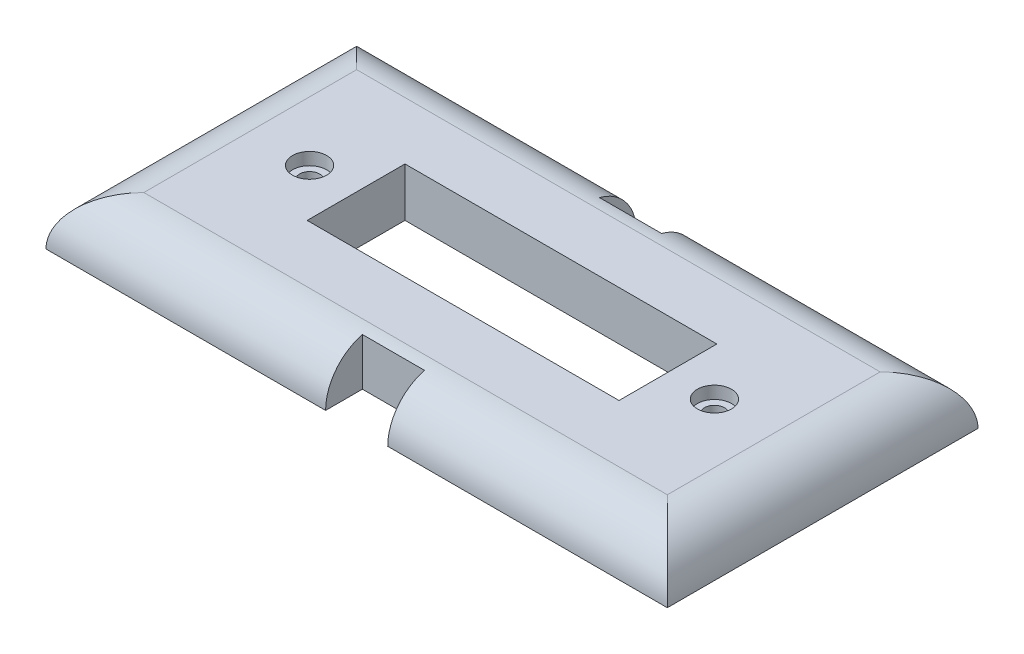
ISO-10303-21;
HEADER;
FILE_DESCRIPTION(('STEP AP214'),'2;1');
FILE_NAME('part.step','',(''),(''),'','','');
FILE_SCHEMA(('AUTOMOTIVE_DESIGN { 1 0 10303 214 1 1 1 1 }'));
ENDSEC;
DATA;
#1=APPLICATION_CONTEXT('core data for automotive mechanical design processes');
#2=APPLICATION_PROTOCOL_DEFINITION('international standard','automotive_design',2000,#1);
#3=PRODUCT_CONTEXT('',#1,'mechanical');
#4=PRODUCT('Part','Part','',(#3));
#5=PRODUCT_RELATED_PRODUCT_CATEGORY('part','',(#4));
#6=PRODUCT_DEFINITION_FORMATION('','',#4);
#7=PRODUCT_DEFINITION_CONTEXT('part definition',#1,'design');
#8=PRODUCT_DEFINITION('design','',#6,#7);
#9=PRODUCT_DEFINITION_SHAPE('','',#8);
#10=(LENGTH_UNIT() NAMED_UNIT(*) SI_UNIT(.MILLI.,.METRE.));
#11=(NAMED_UNIT(*) PLANE_ANGLE_UNIT() SI_UNIT($,.RADIAN.));
#12=(NAMED_UNIT(*) SI_UNIT($,.STERADIAN.) SOLID_ANGLE_UNIT());
#13=UNCERTAINTY_MEASURE_WITH_UNIT(LENGTH_MEASURE(1.E-05),#10,'distance_accuracy_value','');
#14=(GEOMETRIC_REPRESENTATION_CONTEXT(3) GLOBAL_UNCERTAINTY_ASSIGNED_CONTEXT((#13)) GLOBAL_UNIT_ASSIGNED_CONTEXT((#10,
#11,#12)) REPRESENTATION_CONTEXT('',''));
#15=CARTESIAN_POINT('',(0.,0.,0.));
#16=DIRECTION('',(0.,0.,1.));
#17=DIRECTION('',(1.,0.,0.));
#18=AXIS2_PLACEMENT_3D('',#15,#16,#17);
#19=CARTESIAN_POINT('',(33.1,8.,0.));
#20=DIRECTION('',(0.,-1.,0.));
#21=DIRECTION('',(0.,0.,-1.));
#22=AXIS2_PLACEMENT_3D('',#19,#20,#21);
#23=CYLINDRICAL_SURFACE('',#22,1.63195);
#24=CARTESIAN_POINT('',(33.1,0.,0.));
#25=DIRECTION('',(0.,-1.,0.));
#26=DIRECTION('',(0.,0.,-1.));
#27=AXIS2_PLACEMENT_3D('',#24,#25,#26);
#28=CIRCLE('',#27,1.63195);
#29=CARTESIAN_POINT('',(33.1,0.,-1.63195));
#30=VERTEX_POINT('',#29);
#31=EDGE_CURVE('E228',#30,#30,#28,.T.);
#32=ORIENTED_EDGE('',*,*,#31,.T.);
#33=EDGE_LOOP('',(#32));
#34=FACE_BOUND('',#33,.T.);
#35=CARTESIAN_POINT('',(33.1,5.968,0.));
#36=DIRECTION('',(0.,1.,0.));
#37=DIRECTION('',(0.,0.,1.));
#38=AXIS2_PLACEMENT_3D('',#35,#36,#37);
#39=CIRCLE('',#38,1.63195);
#40=CARTESIAN_POINT('',(33.1,5.968,1.63195));
#41=VERTEX_POINT('',#40);
#42=EDGE_CURVE('E36',#41,#41,#39,.F.);
#43=ORIENTED_EDGE('',*,*,#42,.F.);
#44=EDGE_LOOP('',(#43));
#45=FACE_BOUND('',#44,.T.);
#46=ADVANCED_FACE('F32',(#34,#45),#23,.F.);
#47=CARTESIAN_POINT('',(-33.1,8.,0.));
#48=DIRECTION('',(0.,-1.,0.));
#49=DIRECTION('',(0.,0.,-1.));
#50=AXIS2_PLACEMENT_3D('',#47,#48,#49);
#51=CYLINDRICAL_SURFACE('',#50,1.63195);
#52=CARTESIAN_POINT('',(-33.1,0.,0.));
#53=DIRECTION('',(0.,-1.,0.));
#54=DIRECTION('',(0.,0.,-1.));
#55=AXIS2_PLACEMENT_3D('',#52,#53,#54);
#56=CIRCLE('',#55,1.63195);
#57=CARTESIAN_POINT('',(-33.1,0.,-1.63195));
#58=VERTEX_POINT('',#57);
#59=EDGE_CURVE('E183',#58,#58,#56,.T.);
#60=ORIENTED_EDGE('',*,*,#59,.T.);
#61=EDGE_LOOP('',(#60));
#62=FACE_BOUND('',#61,.T.);
#63=CARTESIAN_POINT('',(-33.1,5.968,0.));
#64=DIRECTION('',(0.,1.,0.));
#65=DIRECTION('',(0.,0.,1.));
#66=AXIS2_PLACEMENT_3D('',#63,#64,#65);
#67=CIRCLE('',#66,1.63195);
#68=CARTESIAN_POINT('',(-33.1,5.968,1.63195));
#69=VERTEX_POINT('',#68);
#70=EDGE_CURVE('E143',#69,#69,#67,.F.);
#71=ORIENTED_EDGE('',*,*,#70,.F.);
#72=EDGE_LOOP('',(#71));
#73=FACE_BOUND('',#72,.T.);
#74=ADVANCED_FACE('F291',(#62,#73),#51,.F.);
#75=CARTESIAN_POINT('',(0.,8.,0.));
#76=DIRECTION('',(0.,-1.,0.));
#77=DIRECTION('',(0.,0.,-1.));
#78=AXIS2_PLACEMENT_3D('',#75,#76,#77);
#79=PLANE('',#78);
#80=CARTESIAN_POINT('',(33.1,8.,0.));
#81=DIRECTION('',(0.,1.,0.));
#82=DIRECTION('',(0.,0.,1.));
#83=AXIS2_PLACEMENT_3D('',#80,#81,#82);
#84=CIRCLE('',#83,2.794);
#85=CARTESIAN_POINT('',(33.1,8.,2.794));
#86=VERTEX_POINT('',#85);
#87=EDGE_CURVE('E211',#86,#86,#84,.T.);
#88=ORIENTED_EDGE('',*,*,#87,.F.);
#89=EDGE_LOOP('',(#88));
#90=FACE_BOUND('',#89,.T.);
#91=CARTESIAN_POINT('',(-33.1,8.,0.));
#92=DIRECTION('',(0.,1.,0.));
#93=DIRECTION('',(0.,0.,1.));
#94=AXIS2_PLACEMENT_3D('',#91,#92,#93);
#95=CIRCLE('',#94,2.794);
#96=CARTESIAN_POINT('',(-33.1,8.,2.794));
#97=VERTEX_POINT('',#96);
#98=EDGE_CURVE('E204',#97,#97,#95,.T.);
#99=ORIENTED_EDGE('',*,*,#98,.F.);
#100=EDGE_LOOP('',(#99));
#101=FACE_BOUND('',#100,.T.);
#102=DIRECTION('',(0.,0.,-1.));
#103=VECTOR('',#102,1.);
#104=CARTESIAN_POINT('',(42.8,8.,0.));
#105=LINE('',#104,#103);
#106=CARTESIAN_POINT('',(42.8,8.,17.4));
#107=VERTEX_POINT('',#106);
#108=CARTESIAN_POINT('',(42.8,8.,-17.4));
#109=VERTEX_POINT('',#108);
#110=EDGE_CURVE('E174',#107,#109,#105,.T.);
#111=ORIENTED_EDGE('',*,*,#110,.T.);
#112=DIRECTION('',(-1.,0.,0.));
#113=VECTOR('',#112,1.);
#114=CARTESIAN_POINT('',(0.,8.,-17.4));
#115=LINE('',#114,#113);
#116=CARTESIAN_POINT('',(-42.8,8.,-17.4));
#117=VERTEX_POINT('',#116);
#118=EDGE_CURVE('E176',#109,#117,#115,.T.);
#119=ORIENTED_EDGE('',*,*,#118,.T.);
#120=DIRECTION('',(0.,0.,1.));
#121=VECTOR('',#120,1.);
#122=CARTESIAN_POINT('',(-42.8,8.,0.));
#123=LINE('',#122,#121);
#124=CARTESIAN_POINT('',(-42.8,8.,17.4));
#125=VERTEX_POINT('',#124);
#126=EDGE_CURVE('E170',#117,#125,#123,.T.);
#127=ORIENTED_EDGE('',*,*,#126,.T.);
#128=DIRECTION('',(1.,0.,0.));
#129=VECTOR('',#128,1.);
#130=CARTESIAN_POINT('',(0.,8.,17.4));
#131=LINE('',#130,#129);
#132=EDGE_CURVE('E172',#125,#107,#131,.T.);
#133=ORIENTED_EDGE('',*,*,#132,.T.);
#134=EDGE_LOOP('',(#111,#119,#127,#133));
#135=FACE_BOUND('',#134,.T.);
#136=DIRECTION('',(-1.,0.,0.));
#137=VECTOR('',#136,1.);
#138=CARTESIAN_POINT('',(-25.5,8.,-8.));
#139=LINE('',#138,#137);
#140=CARTESIAN_POINT('',(25.5,8.,-8.));
#141=VERTEX_POINT('',#140);
#142=CARTESIAN_POINT('',(-25.5,8.,-8.));
#143=VERTEX_POINT('',#142);
#144=EDGE_CURVE('E249',#141,#143,#139,.T.);
#145=ORIENTED_EDGE('',*,*,#144,.F.);
#146=DIRECTION('',(0.,0.,-1.));
#147=VECTOR('',#146,1.);
#148=CARTESIAN_POINT('',(25.5,8.,8.));
#149=LINE('',#148,#147);
#150=CARTESIAN_POINT('',(25.5,8.,8.));
#151=VERTEX_POINT('',#150);
#152=EDGE_CURVE('E191',#151,#141,#149,.T.);
#153=ORIENTED_EDGE('',*,*,#152,.F.);
#154=DIRECTION('',(1.,0.,0.));
#155=VECTOR('',#154,1.);
#156=CARTESIAN_POINT('',(-25.5,8.,8.));
#157=LINE('',#156,#155);
#158=CARTESIAN_POINT('',(-25.5,8.,8.));
#159=VERTEX_POINT('',#158);
#160=EDGE_CURVE('E238',#159,#151,#157,.T.);
#161=ORIENTED_EDGE('',*,*,#160,.F.);
#162=DIRECTION('',(0.,0.,1.));
#163=VECTOR('',#162,1.);
#164=CARTESIAN_POINT('',(-25.5,8.,8.));
#165=LINE('',#164,#163);
#166=EDGE_CURVE('E252',#143,#159,#165,.T.);
#167=ORIENTED_EDGE('',*,*,#166,.F.);
#168=EDGE_LOOP('',(#145,#153,#161,#167));
#169=FACE_BOUND('',#168,.T.);
#170=ADVANCED_FACE('F272',(#90,#101,#135,#169),#79,.F.);
#171=CARTESIAN_POINT('',(0.,0.,0.));
#172=DIRECTION('',(0.,-1.,0.));
#173=DIRECTION('',(0.,0.,-1.));
#174=AXIS2_PLACEMENT_3D('',#171,#172,#173);
#175=PLANE('',#174);
#176=DIRECTION('',(0.,0.,-1.));
#177=VECTOR('',#176,1.);
#178=CARTESIAN_POINT('',(-5.08,0.,-19.384));
#179=LINE('',#178,#177);
#180=CARTESIAN_POINT('',(-5.08,0.,-19.384));
#181=VERTEX_POINT('',#180);
#182=CARTESIAN_POINT('',(-5.08,0.,-25.4));
#183=VERTEX_POINT('',#182);
#184=EDGE_CURVE('E133',#181,#183,#179,.T.);
#185=ORIENTED_EDGE('',*,*,#184,.F.);
#186=DIRECTION('',(-1.,0.,0.));
#187=VECTOR('',#186,1.);
#188=CARTESIAN_POINT('',(5.08,0.,-19.384));
#189=LINE('',#188,#187);
#190=CARTESIAN_POINT('',(5.08,0.,-19.384));
#191=VERTEX_POINT('',#190);
#192=EDGE_CURVE('E215',#191,#181,#189,.T.);
#193=ORIENTED_EDGE('',*,*,#192,.F.);
#194=DIRECTION('',(0.,0.,1.));
#195=VECTOR('',#194,1.);
#196=CARTESIAN_POINT('',(5.08,0.,-19.384));
#197=LINE('',#196,#195);
#198=CARTESIAN_POINT('',(5.08,0.,-25.4));
#199=VERTEX_POINT('',#198);
#200=EDGE_CURVE('E142',#199,#191,#197,.T.);
#201=ORIENTED_EDGE('',*,*,#200,.F.);
#202=DIRECTION('',(-1.,0.,0.));
#203=VECTOR('',#202,1.);
#204=CARTESIAN_POINT('',(-50.8,0.,-25.4));
#205=LINE('',#204,#203);
#206=CARTESIAN_POINT('',(50.8,0.,-25.4));
#207=VERTEX_POINT('',#206);
#208=EDGE_CURVE('E156',#207,#199,#205,.T.);
#209=ORIENTED_EDGE('',*,*,#208,.F.);
#210=DIRECTION('',(0.,0.,-1.));
#211=VECTOR('',#210,1.);
#212=CARTESIAN_POINT('',(50.8,0.,25.4));
#213=LINE('',#212,#211);
#214=CARTESIAN_POINT('',(50.8,0.,25.4));
#215=VERTEX_POINT('',#214);
#216=EDGE_CURVE('E157',#215,#207,#213,.T.);
#217=ORIENTED_EDGE('',*,*,#216,.F.);
#218=DIRECTION('',(1.,0.,0.));
#219=VECTOR('',#218,1.);
#220=CARTESIAN_POINT('',(-50.8,0.,25.4));
#221=LINE('',#220,#219);
#222=CARTESIAN_POINT('',(5.08,0.,25.4));
#223=VERTEX_POINT('',#222);
#224=EDGE_CURVE('E166',#223,#215,#221,.T.);
#225=ORIENTED_EDGE('',*,*,#224,.F.);
#226=DIRECTION('',(0.,0.,1.));
#227=VECTOR('',#226,1.);
#228=CARTESIAN_POINT('',(5.08,0.,19.384));
#229=LINE('',#228,#227);
#230=CARTESIAN_POINT('',(5.08,0.,19.384));
#231=VERTEX_POINT('',#230);
#232=EDGE_CURVE('E224',#231,#223,#229,.T.);
#233=ORIENTED_EDGE('',*,*,#232,.F.);
#234=DIRECTION('',(1.,0.,0.));
#235=VECTOR('',#234,1.);
#236=CARTESIAN_POINT('',(5.08,0.,19.384));
#237=LINE('',#236,#235);
#238=CARTESIAN_POINT('',(-5.08,0.,19.384));
#239=VERTEX_POINT('',#238);
#240=EDGE_CURVE('E222',#239,#231,#237,.T.);
#241=ORIENTED_EDGE('',*,*,#240,.F.);
#242=DIRECTION('',(0.,0.,-1.));
#243=VECTOR('',#242,1.);
#244=CARTESIAN_POINT('',(-5.08,0.,19.384));
#245=LINE('',#244,#243);
#246=CARTESIAN_POINT('',(-5.08,0.,25.4));
#247=VERTEX_POINT('',#246);
#248=EDGE_CURVE('E218',#247,#239,#245,.T.);
#249=ORIENTED_EDGE('',*,*,#248,.F.);
#250=CARTESIAN_POINT('',(-50.8,0.,25.4));
#251=VERTEX_POINT('',#250);
#252=EDGE_CURVE('E167',#251,#247,#221,.T.);
#253=ORIENTED_EDGE('',*,*,#252,.F.);
#254=DIRECTION('',(0.,0.,1.));
#255=VECTOR('',#254,1.);
#256=CARTESIAN_POINT('',(-50.8,0.,25.4));
#257=LINE('',#256,#255);
#258=CARTESIAN_POINT('',(-50.8,0.,-25.4));
#259=VERTEX_POINT('',#258);
#260=EDGE_CURVE('E154',#259,#251,#257,.T.);
#261=ORIENTED_EDGE('',*,*,#260,.F.);
#262=EDGE_CURVE('E148',#183,#259,#205,.T.);
#263=ORIENTED_EDGE('',*,*,#262,.F.);
#264=EDGE_LOOP('',(#185,#193,#201,#209,#217,#225,#233,#241,#249,#253,#261,#263));
#265=FACE_BOUND('',#264,.T.);
#266=ORIENTED_EDGE('',*,*,#31,.F.);
#267=EDGE_LOOP('',(#266));
#268=FACE_BOUND('',#267,.T.);
#269=ORIENTED_EDGE('',*,*,#59,.F.);
#270=EDGE_LOOP('',(#269));
#271=FACE_BOUND('',#270,.T.);
#272=DIRECTION('',(0.,0.,-1.));
#273=VECTOR('',#272,1.);
#274=CARTESIAN_POINT('',(25.5,0.,8.));
#275=LINE('',#274,#273);
#276=CARTESIAN_POINT('',(25.5,0.,8.));
#277=VERTEX_POINT('',#276);
#278=CARTESIAN_POINT('',(25.5,0.,-8.));
#279=VERTEX_POINT('',#278);
#280=EDGE_CURVE('E234',#277,#279,#275,.T.);
#281=ORIENTED_EDGE('',*,*,#280,.T.);
#282=DIRECTION('',(-1.,0.,0.));
#283=VECTOR('',#282,1.);
#284=CARTESIAN_POINT('',(-25.5,0.,-8.));
#285=LINE('',#284,#283);
#286=CARTESIAN_POINT('',(-25.5,0.,-8.));
#287=VERTEX_POINT('',#286);
#288=EDGE_CURVE('E237',#279,#287,#285,.T.);
#289=ORIENTED_EDGE('',*,*,#288,.T.);
#290=DIRECTION('',(0.,0.,1.));
#291=VECTOR('',#290,1.);
#292=CARTESIAN_POINT('',(-25.5,0.,8.));
#293=LINE('',#292,#291);
#294=CARTESIAN_POINT('',(-25.5,0.,8.));
#295=VERTEX_POINT('',#294);
#296=EDGE_CURVE('E241',#287,#295,#293,.T.);
#297=ORIENTED_EDGE('',*,*,#296,.T.);
#298=DIRECTION('',(1.,0.,0.));
#299=VECTOR('',#298,1.);
#300=CARTESIAN_POINT('',(-25.5,0.,8.));
#301=LINE('',#300,#299);
#302=EDGE_CURVE('E244',#295,#277,#301,.T.);
#303=ORIENTED_EDGE('',*,*,#302,.T.);
#304=EDGE_LOOP('',(#281,#289,#297,#303));
#305=FACE_BOUND('',#304,.T.);
#306=ADVANCED_FACE('F151',(#265,#268,#271,#305),#175,.T.);
#307=CARTESIAN_POINT('',(25.5,0.,8.));
#308=DIRECTION('',(1.,0.,0.));
#309=DIRECTION('',(0.,0.,-1.));
#310=AXIS2_PLACEMENT_3D('',#307,#308,#309);
#311=PLANE('',#310);
#312=ORIENTED_EDGE('',*,*,#152,.T.);
#313=DIRECTION('',(0.,1.,0.));
#314=VECTOR('',#313,1.);
#315=CARTESIAN_POINT('',(25.5,0.,-8.));
#316=LINE('',#315,#314);
#317=EDGE_CURVE('E247',#279,#141,#316,.T.);
#318=ORIENTED_EDGE('',*,*,#317,.F.);
#319=ORIENTED_EDGE('',*,*,#280,.F.);
#320=DIRECTION('',(0.,1.,0.));
#321=VECTOR('',#320,1.);
#322=CARTESIAN_POINT('',(25.5,0.,8.));
#323=LINE('',#322,#321);
#324=EDGE_CURVE('E161',#277,#151,#323,.T.);
#325=ORIENTED_EDGE('',*,*,#324,.T.);
#326=EDGE_LOOP('',(#312,#318,#319,#325));
#327=FACE_BOUND('',#326,.T.);
#328=ADVANCED_FACE('F278',(#327),#311,.F.);
#329=CARTESIAN_POINT('',(-25.5,0.,8.));
#330=DIRECTION('',(0.,0.,1.));
#331=DIRECTION('',(1.,0.,0.));
#332=AXIS2_PLACEMENT_3D('',#329,#330,#331);
#333=PLANE('',#332);
#334=ORIENTED_EDGE('',*,*,#160,.T.);
#335=ORIENTED_EDGE('',*,*,#324,.F.);
#336=ORIENTED_EDGE('',*,*,#302,.F.);
#337=DIRECTION('',(0.,1.,0.));
#338=VECTOR('',#337,1.);
#339=CARTESIAN_POINT('',(-25.5,0.,8.));
#340=LINE('',#339,#338);
#341=EDGE_CURVE('E258',#295,#159,#340,.T.);
#342=ORIENTED_EDGE('',*,*,#341,.T.);
#343=EDGE_LOOP('',(#334,#335,#336,#342));
#344=FACE_BOUND('',#343,.T.);
#345=ADVANCED_FACE('F280',(#344),#333,.F.);
#346=CARTESIAN_POINT('',(-25.5,0.,8.));
#347=DIRECTION('',(-1.,0.,0.));
#348=DIRECTION('',(0.,0.,1.));
#349=AXIS2_PLACEMENT_3D('',#346,#347,#348);
#350=PLANE('',#349);
#351=ORIENTED_EDGE('',*,*,#166,.T.);
#352=ORIENTED_EDGE('',*,*,#341,.F.);
#353=ORIENTED_EDGE('',*,*,#296,.F.);
#354=DIRECTION('',(0.,1.,0.));
#355=VECTOR('',#354,1.);
#356=CARTESIAN_POINT('',(-25.5,0.,-8.));
#357=LINE('',#356,#355);
#358=EDGE_CURVE('E260',#287,#143,#357,.T.);
#359=ORIENTED_EDGE('',*,*,#358,.T.);
#360=EDGE_LOOP('',(#351,#352,#353,#359));
#361=FACE_BOUND('',#360,.T.);
#362=ADVANCED_FACE('F275',(#361),#350,.F.);
#363=CARTESIAN_POINT('',(-25.5,0.,-8.));
#364=DIRECTION('',(0.,0.,-1.));
#365=DIRECTION('',(-1.,0.,0.));
#366=AXIS2_PLACEMENT_3D('',#363,#364,#365);
#367=PLANE('',#366);
#368=ORIENTED_EDGE('',*,*,#144,.T.);
#369=ORIENTED_EDGE('',*,*,#358,.F.);
#370=ORIENTED_EDGE('',*,*,#288,.F.);
#371=ORIENTED_EDGE('',*,*,#317,.T.);
#372=EDGE_LOOP('',(#368,#369,#370,#371));
#373=FACE_BOUND('',#372,.T.);
#374=ADVANCED_FACE('F265',(#373),#367,.F.);
#375=CARTESIAN_POINT('',(0.,0.,17.4));
#376=DIRECTION('',(1.,0.,0.));
#377=DIRECTION('',(0.,0.,-1.));
#378=AXIS2_PLACEMENT_3D('',#375,#376,#377);
#379=CYLINDRICAL_SURFACE('',#378,8.);
#380=CARTESIAN_POINT('',(-5.08,0.,17.4));
#381=DIRECTION('',(-1.,0.,0.));
#382=DIRECTION('',(0.,0.,1.));
#383=AXIS2_PLACEMENT_3D('',#380,#381,#382);
#384=CIRCLE('',#383,8.);
#385=CARTESIAN_POINT('',(-5.08,7.75008025764895,19.384));
#386=VERTEX_POINT('',#385);
#387=EDGE_CURVE('E195',#386,#247,#384,.F.);
#388=ORIENTED_EDGE('',*,*,#387,.F.);
#389=DIRECTION('',(1.,0.,0.));
#390=VECTOR('',#389,1.);
#391=CARTESIAN_POINT('',(0.,7.75008025764895,19.384));
#392=LINE('',#391,#390);
#393=CARTESIAN_POINT('',(5.08,7.75008025764895,19.384));
#394=VERTEX_POINT('',#393);
#395=EDGE_CURVE('E179',#394,#386,#392,.F.);
#396=ORIENTED_EDGE('',*,*,#395,.F.);
#397=CARTESIAN_POINT('',(5.08,0.,17.4));
#398=DIRECTION('',(1.,0.,0.));
#399=DIRECTION('',(0.,0.,-1.));
#400=AXIS2_PLACEMENT_3D('',#397,#398,#399);
#401=CIRCLE('',#400,8.);
#402=EDGE_CURVE('E193',#223,#394,#401,.F.);
#403=ORIENTED_EDGE('',*,*,#402,.F.);
#404=ORIENTED_EDGE('',*,*,#224,.T.);
#405=CARTESIAN_POINT('',(42.8,0.,17.4));
#406=DIRECTION('',(0.707106781186547,0.,-0.707106781186547));
#407=DIRECTION('',(0.707106781186547,0.,0.707106781186547));
#408=AXIS2_PLACEMENT_3D('',#405,#406,#407);
#409=ELLIPSE('',#408,11.3137084989848,8.);
#410=EDGE_CURVE('E188',#107,#215,#409,.T.);
#411=ORIENTED_EDGE('',*,*,#410,.F.);
#412=ORIENTED_EDGE('',*,*,#132,.F.);
#413=CARTESIAN_POINT('',(-42.8,0.,17.4));
#414=DIRECTION('',(0.707106781186547,0.,0.707106781186547));
#415=DIRECTION('',(-0.707106781186547,0.,0.707106781186547));
#416=AXIS2_PLACEMENT_3D('',#413,#414,#415);
#417=ELLIPSE('',#416,11.3137084989848,8.);
#418=EDGE_CURVE('E185',#251,#125,#417,.F.);
#419=ORIENTED_EDGE('',*,*,#418,.F.);
#420=ORIENTED_EDGE('',*,*,#252,.T.);
#421=EDGE_LOOP('',(#388,#396,#403,#404,#411,#412,#419,#420));
#422=FACE_BOUND('',#421,.T.);
#423=ADVANCED_FACE('F34',(#422),#379,.T.);
#424=CARTESIAN_POINT('',(42.8,0.,0.));
#425=DIRECTION('',(0.,0.,-1.));
#426=DIRECTION('',(-1.,0.,0.));
#427=AXIS2_PLACEMENT_3D('',#424,#425,#426);
#428=CYLINDRICAL_SURFACE('',#427,8.);
#429=ORIENTED_EDGE('',*,*,#410,.T.);
#430=ORIENTED_EDGE('',*,*,#216,.T.);
#431=CARTESIAN_POINT('',(42.8,0.,-17.4));
#432=DIRECTION('',(-0.707106781186547,0.,-0.707106781186547));
#433=DIRECTION('',(0.707106781186547,0.,-0.707106781186547));
#434=AXIS2_PLACEMENT_3D('',#431,#432,#433);
#435=ELLIPSE('',#434,11.3137084989848,8.);
#436=EDGE_CURVE('E182',#109,#207,#435,.T.);
#437=ORIENTED_EDGE('',*,*,#436,.F.);
#438=ORIENTED_EDGE('',*,*,#110,.F.);
#439=EDGE_LOOP('',(#429,#430,#437,#438));
#440=FACE_BOUND('',#439,.T.);
#441=ADVANCED_FACE('F357',(#440),#428,.T.);
#442=CARTESIAN_POINT('',(-42.8,0.,0.));
#443=DIRECTION('',(0.,0.,1.));
#444=DIRECTION('',(1.,0.,0.));
#445=AXIS2_PLACEMENT_3D('',#442,#443,#444);
#446=CYLINDRICAL_SURFACE('',#445,8.);
#447=ORIENTED_EDGE('',*,*,#418,.T.);
#448=ORIENTED_EDGE('',*,*,#126,.F.);
#449=CARTESIAN_POINT('',(-42.8,0.,-17.4));
#450=DIRECTION('',(-0.707106781186547,0.,0.707106781186547));
#451=DIRECTION('',(0.707106781186547,0.,0.707106781186547));
#452=AXIS2_PLACEMENT_3D('',#449,#450,#451);
#453=ELLIPSE('',#452,11.3137084989848,8.);
#454=EDGE_CURVE('E180',#259,#117,#453,.F.);
#455=ORIENTED_EDGE('',*,*,#454,.F.);
#456=ORIENTED_EDGE('',*,*,#260,.T.);
#457=EDGE_LOOP('',(#447,#448,#455,#456));
#458=FACE_BOUND('',#457,.T.);
#459=ADVANCED_FACE('F362',(#458),#446,.T.);
#460=CARTESIAN_POINT('',(0.,0.,-17.4));
#461=DIRECTION('',(-1.,0.,0.));
#462=DIRECTION('',(0.,0.,1.));
#463=AXIS2_PLACEMENT_3D('',#460,#461,#462);
#464=CYLINDRICAL_SURFACE('',#463,8.);
#465=CARTESIAN_POINT('',(-5.08,0.,-17.4));
#466=DIRECTION('',(-1.,0.,0.));
#467=DIRECTION('',(0.,0.,1.));
#468=AXIS2_PLACEMENT_3D('',#465,#466,#467);
#469=CIRCLE('',#468,8.);
#470=CARTESIAN_POINT('',(-5.08,7.75008025764895,-19.384));
#471=VERTEX_POINT('',#470);
#472=EDGE_CURVE('E11',#183,#471,#469,.F.);
#473=ORIENTED_EDGE('',*,*,#472,.F.);
#474=ORIENTED_EDGE('',*,*,#262,.T.);
#475=ORIENTED_EDGE('',*,*,#454,.T.);
#476=ORIENTED_EDGE('',*,*,#118,.F.);
#477=ORIENTED_EDGE('',*,*,#436,.T.);
#478=ORIENTED_EDGE('',*,*,#208,.T.);
#479=CARTESIAN_POINT('',(5.08,0.,-17.4));
#480=DIRECTION('',(1.,0.,0.));
#481=DIRECTION('',(0.,0.,-1.));
#482=AXIS2_PLACEMENT_3D('',#479,#480,#481);
#483=CIRCLE('',#482,8.);
#484=CARTESIAN_POINT('',(5.08,7.75008025764895,-19.384));
#485=VERTEX_POINT('',#484);
#486=EDGE_CURVE('E197',#485,#199,#483,.F.);
#487=ORIENTED_EDGE('',*,*,#486,.F.);
#488=DIRECTION('',(-1.,0.,0.));
#489=VECTOR('',#488,1.);
#490=CARTESIAN_POINT('',(0.,7.75008025764895,-19.384));
#491=LINE('',#490,#489);
#492=EDGE_CURVE('E41',#471,#485,#491,.F.);
#493=ORIENTED_EDGE('',*,*,#492,.F.);
#494=EDGE_LOOP('',(#473,#474,#475,#476,#477,#478,#487,#493));
#495=FACE_BOUND('',#494,.T.);
#496=ADVANCED_FACE('F147',(#495),#464,.T.);
#497=CARTESIAN_POINT('',(-5.08,8.,19.384));
#498=DIRECTION('',(-1.,0.,0.));
#499=DIRECTION('',(0.,0.,1.));
#500=AXIS2_PLACEMENT_3D('',#497,#498,#499);
#501=PLANE('',#500);
#502=ORIENTED_EDGE('',*,*,#387,.T.);
#503=ORIENTED_EDGE('',*,*,#248,.T.);
#504=DIRECTION('',(0.,-1.,0.));
#505=VECTOR('',#504,1.);
#506=CARTESIAN_POINT('',(-5.08,8.,19.384));
#507=LINE('',#506,#505);
#508=EDGE_CURVE('E226',#386,#239,#507,.T.);
#509=ORIENTED_EDGE('',*,*,#508,.F.);
#510=EDGE_LOOP('',(#502,#503,#509));
#511=FACE_BOUND('',#510,.T.);
#512=ADVANCED_FACE('F300',(#511),#501,.F.);
#513=CARTESIAN_POINT('',(5.08,8.,19.384));
#514=DIRECTION('',(1.,0.,0.));
#515=DIRECTION('',(0.,0.,-1.));
#516=AXIS2_PLACEMENT_3D('',#513,#514,#515);
#517=PLANE('',#516);
#518=ORIENTED_EDGE('',*,*,#402,.T.);
#519=DIRECTION('',(0.,-1.,0.));
#520=VECTOR('',#519,1.);
#521=CARTESIAN_POINT('',(5.08,8.,19.384));
#522=LINE('',#521,#520);
#523=EDGE_CURVE('E57',#394,#231,#522,.T.);
#524=ORIENTED_EDGE('',*,*,#523,.T.);
#525=ORIENTED_EDGE('',*,*,#232,.T.);
#526=EDGE_LOOP('',(#518,#524,#525));
#527=FACE_BOUND('',#526,.T.);
#528=ADVANCED_FACE('F303',(#527),#517,.F.);
#529=CARTESIAN_POINT('',(5.08,8.,19.384));
#530=DIRECTION('',(0.,0.,-1.));
#531=DIRECTION('',(-1.,0.,0.));
#532=AXIS2_PLACEMENT_3D('',#529,#530,#531);
#533=PLANE('',#532);
#534=ORIENTED_EDGE('',*,*,#395,.T.);
#535=ORIENTED_EDGE('',*,*,#508,.T.);
#536=ORIENTED_EDGE('',*,*,#240,.T.);
#537=ORIENTED_EDGE('',*,*,#523,.F.);
#538=EDGE_LOOP('',(#534,#535,#536,#537));
#539=FACE_BOUND('',#538,.T.);
#540=ADVANCED_FACE('F305',(#539),#533,.F.);
#541=CARTESIAN_POINT('',(-5.08,8.,-19.384));
#542=DIRECTION('',(-1.,0.,0.));
#543=DIRECTION('',(0.,0.,1.));
#544=AXIS2_PLACEMENT_3D('',#541,#542,#543);
#545=PLANE('',#544);
#546=ORIENTED_EDGE('',*,*,#472,.T.);
#547=DIRECTION('',(0.,-1.,0.));
#548=VECTOR('',#547,1.);
#549=CARTESIAN_POINT('',(-5.08,8.,-19.384));
#550=LINE('',#549,#548);
#551=EDGE_CURVE('E137',#471,#181,#550,.T.);
#552=ORIENTED_EDGE('',*,*,#551,.T.);
#553=ORIENTED_EDGE('',*,*,#184,.T.);
#554=EDGE_LOOP('',(#546,#552,#553));
#555=FACE_BOUND('',#554,.T.);
#556=ADVANCED_FACE('F135',(#555),#545,.F.);
#557=CARTESIAN_POINT('',(5.08,8.,-19.384));
#558=DIRECTION('',(0.,0.,1.));
#559=DIRECTION('',(1.,0.,0.));
#560=AXIS2_PLACEMENT_3D('',#557,#558,#559);
#561=PLANE('',#560);
#562=ORIENTED_EDGE('',*,*,#492,.T.);
#563=DIRECTION('',(0.,-1.,0.));
#564=VECTOR('',#563,1.);
#565=CARTESIAN_POINT('',(5.08,8.,-19.384));
#566=LINE('',#565,#564);
#567=EDGE_CURVE('E49',#485,#191,#566,.T.);
#568=ORIENTED_EDGE('',*,*,#567,.T.);
#569=ORIENTED_EDGE('',*,*,#192,.T.);
#570=ORIENTED_EDGE('',*,*,#551,.F.);
#571=EDGE_LOOP('',(#562,#568,#569,#570));
#572=FACE_BOUND('',#571,.T.);
#573=ADVANCED_FACE('F313',(#572),#561,.F.);
#574=CARTESIAN_POINT('',(5.08,8.,-19.384));
#575=DIRECTION('',(1.,0.,0.));
#576=DIRECTION('',(0.,0.,-1.));
#577=AXIS2_PLACEMENT_3D('',#574,#575,#576);
#578=PLANE('',#577);
#579=ORIENTED_EDGE('',*,*,#486,.T.);
#580=ORIENTED_EDGE('',*,*,#200,.T.);
#581=ORIENTED_EDGE('',*,*,#567,.F.);
#582=EDGE_LOOP('',(#579,#580,#581));
#583=FACE_BOUND('',#582,.T.);
#584=ADVANCED_FACE('F314',(#583),#578,.F.);
#585=CARTESIAN_POINT('',(-33.1,5.968,0.));
#586=DIRECTION('',(0.,1.,0.));
#587=DIRECTION('',(0.,0.,1.));
#588=AXIS2_PLACEMENT_3D('',#585,#586,#587);
#589=PLANE('',#588);
#590=CARTESIAN_POINT('',(-33.1,5.968,0.));
#591=DIRECTION('',(0.,1.,0.));
#592=DIRECTION('',(0.,0.,1.));
#593=AXIS2_PLACEMENT_3D('',#590,#591,#592);
#594=CIRCLE('',#593,2.794);
#595=CARTESIAN_POINT('',(-33.1,5.968,2.794));
#596=VERTEX_POINT('',#595);
#597=EDGE_CURVE('E200',#596,#596,#594,.T.);
#598=ORIENTED_EDGE('',*,*,#597,.T.);
#599=EDGE_LOOP('',(#598));
#600=FACE_BOUND('',#599,.T.);
#601=ORIENTED_EDGE('',*,*,#70,.T.);
#602=EDGE_LOOP('',(#601));
#603=FACE_BOUND('',#602,.T.);
#604=ADVANCED_FACE('F317',(#600,#603),#589,.T.);
#605=CARTESIAN_POINT('',(-33.1,5.968,0.));
#606=DIRECTION('',(0.,1.,0.));
#607=DIRECTION('',(0.,0.,1.));
#608=AXIS2_PLACEMENT_3D('',#605,#606,#607);
#609=CYLINDRICAL_SURFACE('',#608,2.794);
#610=ORIENTED_EDGE('',*,*,#597,.F.);
#611=EDGE_LOOP('',(#610));
#612=FACE_BOUND('',#611,.T.);
#613=ORIENTED_EDGE('',*,*,#98,.T.);
#614=EDGE_LOOP('',(#613));
#615=FACE_BOUND('',#614,.T.);
#616=ADVANCED_FACE('F321',(#612,#615),#609,.F.);
#617=CARTESIAN_POINT('',(33.1,5.968,0.));
#618=DIRECTION('',(0.,1.,0.));
#619=DIRECTION('',(0.,0.,1.));
#620=AXIS2_PLACEMENT_3D('',#617,#618,#619);
#621=PLANE('',#620);
#622=CARTESIAN_POINT('',(33.1,5.968,0.));
#623=DIRECTION('',(0.,1.,0.));
#624=DIRECTION('',(0.,0.,1.));
#625=AXIS2_PLACEMENT_3D('',#622,#623,#624);
#626=CIRCLE('',#625,2.794);
#627=CARTESIAN_POINT('',(33.1,5.968,2.794));
#628=VERTEX_POINT('',#627);
#629=EDGE_CURVE('E339',#628,#628,#626,.T.);
#630=ORIENTED_EDGE('',*,*,#629,.T.);
#631=EDGE_LOOP('',(#630));
#632=FACE_BOUND('',#631,.T.);
#633=ORIENTED_EDGE('',*,*,#42,.T.);
#634=EDGE_LOOP('',(#633));
#635=FACE_BOUND('',#634,.T.);
#636=ADVANCED_FACE('F324',(#632,#635),#621,.T.);
#637=CARTESIAN_POINT('',(33.1,5.968,0.));
#638=DIRECTION('',(0.,1.,0.));
#639=DIRECTION('',(0.,0.,1.));
#640=AXIS2_PLACEMENT_3D('',#637,#638,#639);
#641=CYLINDRICAL_SURFACE('',#640,2.794);
#642=ORIENTED_EDGE('',*,*,#629,.F.);
#643=EDGE_LOOP('',(#642));
#644=FACE_BOUND('',#643,.T.);
#645=ORIENTED_EDGE('',*,*,#87,.T.);
#646=EDGE_LOOP('',(#645));
#647=FACE_BOUND('',#646,.T.);
#648=ADVANCED_FACE('F328',(#644,#647),#641,.F.);
#649=CLOSED_SHELL('',(#46,#74,#170,#306,#328,#345,#362,#374,#423,#441,#459,#496,#512,#528,#540,
#556,#573,#584,#604,#616,#636,#648));
#650=MANIFOLD_SOLID_BREP('B2',#649);
#651=ADVANCED_BREP_SHAPE_REPRESENTATION('',(#18,#650),#14);
#652=SHAPE_DEFINITION_REPRESENTATION(#9,#651);
ENDSEC;
END-ISO-10303-21;
